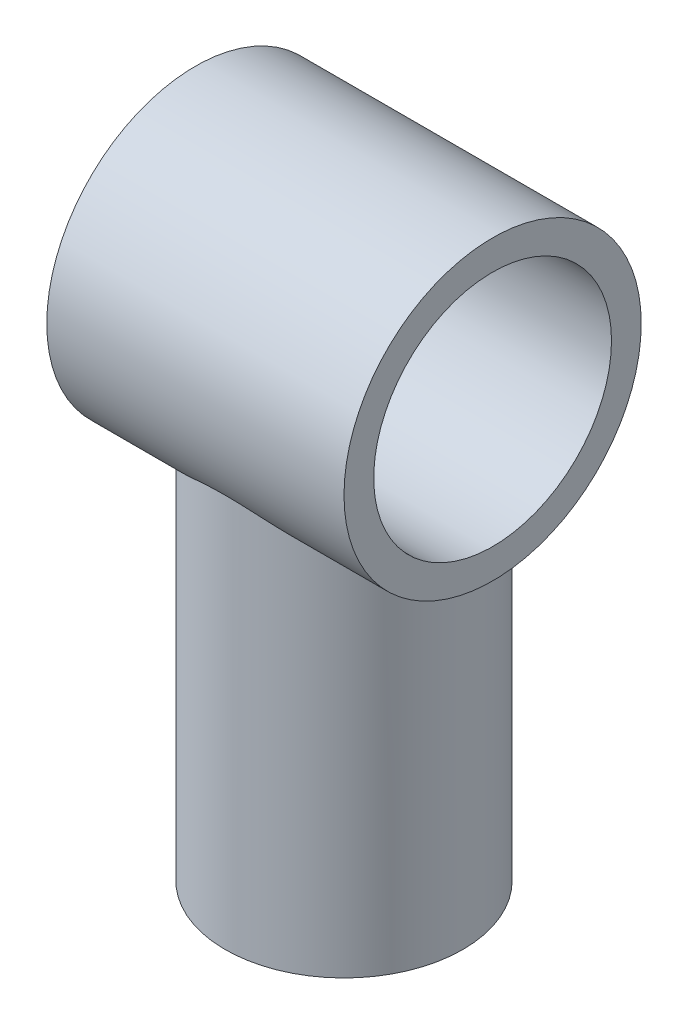
ISO-10303-21;
HEADER;
FILE_DESCRIPTION(('STEP AP214'),'2;1');
FILE_NAME('part.step','',(''),(''),'','','');
FILE_SCHEMA(('AUTOMOTIVE_DESIGN { 1 0 10303 214 1 1 1 1 }'));
ENDSEC;
DATA;
#1=APPLICATION_CONTEXT('core data for automotive mechanical design processes');
#2=APPLICATION_PROTOCOL_DEFINITION('international standard','automotive_design',2000,#1);
#3=PRODUCT_CONTEXT('',#1,'mechanical');
#4=PRODUCT('Part','Part','',(#3));
#5=PRODUCT_RELATED_PRODUCT_CATEGORY('part','',(#4));
#6=PRODUCT_DEFINITION_FORMATION('','',#4);
#7=PRODUCT_DEFINITION_CONTEXT('part definition',#1,'design');
#8=PRODUCT_DEFINITION('design','',#6,#7);
#9=PRODUCT_DEFINITION_SHAPE('','',#8);
#10=(LENGTH_UNIT() NAMED_UNIT(*) SI_UNIT(.MILLI.,.METRE.));
#11=(NAMED_UNIT(*) PLANE_ANGLE_UNIT() SI_UNIT($,.RADIAN.));
#12=(NAMED_UNIT(*) SI_UNIT($,.STERADIAN.) SOLID_ANGLE_UNIT());
#13=UNCERTAINTY_MEASURE_WITH_UNIT(LENGTH_MEASURE(1.E-05),#10,'distance_accuracy_value','');
#14=(GEOMETRIC_REPRESENTATION_CONTEXT(3) GLOBAL_UNCERTAINTY_ASSIGNED_CONTEXT((#13)) GLOBAL_UNIT_ASSIGNED_CONTEXT((#10,
#11,#12)) REPRESENTATION_CONTEXT('',''));
#15=CARTESIAN_POINT('',(0.,0.,0.));
#16=DIRECTION('',(0.,0.,1.));
#17=DIRECTION('',(1.,0.,0.));
#18=AXIS2_PLACEMENT_3D('',#15,#16,#17);
#19=CARTESIAN_POINT('',(50.,0.,0.));
#20=DIRECTION('',(-1.,0.,0.));
#21=DIRECTION('',(0.,0.,1.));
#22=AXIS2_PLACEMENT_3D('',#19,#20,#21);
#23=CYLINDRICAL_SURFACE('',#22,50.);
#24=CARTESIAN_POINT('',(39.9999999999997,-50.,0.));
#25=CARTESIAN_POINT('',(39.9999899655502,-49.9999902865793,0.960337317603068));
#26=CARTESIAN_POINT('',(39.9653441303406,-49.9722619065888,1.92103825174153));
#27=CARTESIAN_POINT('',(39.8273406683369,-49.8619634243921,3.83460710770071));
#28=CARTESIAN_POINT('',(39.7239466787064,-49.7793642995239,4.78747061392244));
#29=CARTESIAN_POINT('',(39.4500093404145,-49.5610369060738,6.67920680850694));
#30=CARTESIAN_POINT('',(39.2793376397599,-49.425207087218,7.61804917305092));
#31=CARTESIAN_POINT('',(38.8737383716898,-49.103485637529,9.47278784316621));
#32=CARTESIAN_POINT('',(38.6388179728261,-48.9175995917573,10.3886866962233));
#33=CARTESIAN_POINT('',(38.1100030483725,-48.5009896347149,12.1860448986505));
#34=CARTESIAN_POINT('',(37.8164961975768,-48.2705607705022,13.0676873720396));
#35=CARTESIAN_POINT('',(37.1734863365713,-47.7684806682389,14.7981074225096));
#36=CARTESIAN_POINT('',(36.8239829762033,-47.4968291724149,15.6468847940366));
#37=CARTESIAN_POINT('',(36.0730992030747,-46.9170712371719,17.3078631155302));
#38=CARTESIAN_POINT('',(35.6717317573899,-46.6089739115738,18.1200731398627));
#39=CARTESIAN_POINT('',(34.8208209286228,-45.9609995364829,19.7058441108159));
#40=CARTESIAN_POINT('',(34.3712676903182,-45.6211159877168,20.4793971034719));
#41=CARTESIAN_POINT('',(33.5813865490853,-45.029602734129,21.7405090451485));
#42=CARTESIAN_POINT('',(33.2531653527827,-44.7852783783389,22.2391661899704));
#43=CARTESIAN_POINT('',(32.5775571715153,-44.2859517021198,23.2175821753519));
#44=CARTESIAN_POINT('',(32.2301742772415,-44.0309516635446,23.6973450123229));
#45=CARTESIAN_POINT('',(31.1602744893443,-43.2518566181224,25.1083888673532));
#46=CARTESIAN_POINT('',(30.4101180866669,-42.7137507901915,26.0112478729575));
#47=CARTESIAN_POINT('',(28.8404448127055,-41.6107960537086,27.7416200402567));
#48=CARTESIAN_POINT('',(28.0207491560544,-41.0458799641914,28.5689268910586));
#49=CARTESIAN_POINT('',(26.3178577666686,-39.9027716762532,30.1449198378464));
#50=CARTESIAN_POINT('',(25.4346692627176,-39.324580994256,30.8936148601352));
#51=CARTESIAN_POINT('',(23.5925581067073,-38.1587647692529,32.322928156125));
#52=CARTESIAN_POINT('',(22.6326666595114,-37.5711331588899,33.0022979067522));
#53=CARTESIAN_POINT('',(21.1458355455337,-36.7013004136444,33.9588113294495));
#54=CARTESIAN_POINT('',(20.64224039534,-36.4132103029056,34.2673057721559));
#55=CARTESIAN_POINT('',(19.6192733098942,-35.843204539501,34.8630820045459));
#56=CARTESIAN_POINT('',(19.0999029436203,-35.5612882775625,35.1503658941106));
#57=CARTESIAN_POINT('',(18.0466515838972,-35.0068809747348,35.7025344651925));
#58=CARTESIAN_POINT('',(17.5128134287128,-34.7343665987454,35.9674773777478));
#59=CARTESIAN_POINT('',(16.4290760361568,-34.2007613147399,36.4752457872218));
#60=CARTESIAN_POINT('',(15.8791759991225,-33.9396709771072,36.7180701804528));
#61=CARTESIAN_POINT('',(14.7636195685685,-33.4322884721389,37.1806380629351));
#62=CARTESIAN_POINT('',(14.1979755903773,-33.1859851023898,37.4003991215583));
#63=CARTESIAN_POINT('',(13.0505560059608,-32.7115298291724,37.8160719858137));
#64=CARTESIAN_POINT('',(12.4687814889326,-32.4833767041346,38.0119853969403));
#65=CARTESIAN_POINT('',(11.2008152379518,-32.0165695692072,38.4063287968087));
#66=CARTESIAN_POINT('',(10.5120434704498,-31.7814677720162,38.6007341429587));
#67=CARTESIAN_POINT('',(9.11450642112936,-31.3469842966395,38.9543981140488));
#68=CARTESIAN_POINT('',(8.40574433067222,-31.1475969537523,39.1136623136884));
#69=CARTESIAN_POINT('',(6.97174066571709,-30.7916235882113,39.3945089701146));
#70=CARTESIAN_POINT('',(6.24653727800009,-30.6349475833404,39.5161707194822));
#71=CARTESIAN_POINT('',(4.78173507298056,-30.3701570484457,39.7200407558248));
#72=CARTESIAN_POINT('',(4.04213643118777,-30.2620419267447,39.802249523505));
#73=CARTESIAN_POINT('',(2.54689613390467,-30.09866807773,39.9259430521321));
#74=CARTESIAN_POINT('',(1.79117012816347,-30.0438912510192,39.9670566128739));
#75=CARTESIAN_POINT('',(0.276633037623535,-29.991729924435,40.0062151100752));
#76=CARTESIAN_POINT('',(-0.482177893098768,-29.9943425926148,40.0042621716977));
#77=CARTESIAN_POINT('',(-1.99661799876641,-30.0568391497324,39.9573259270323));
#78=CARTESIAN_POINT('',(-2.75224446591365,-30.1167645880198,39.9123114028992));
#79=CARTESIAN_POINT('',(-4.2534931367538,-30.2908537992577,39.7803459798636));
#80=CARTESIAN_POINT('',(-4.99911392684159,-30.4050251548359,39.6933892181461));
#81=CARTESIAN_POINT('',(-6.59074393125172,-30.7039918232986,39.4627146667173));
#82=CARTESIAN_POINT('',(-7.4342169983334,-30.8970395344005,39.3122468772218));
#83=CARTESIAN_POINT('',(-9.09582896297436,-31.3383396252938,38.9613603015859));
#84=CARTESIAN_POINT('',(-9.9139623495815,-31.5866039190394,38.7609307341793));
#85=CARTESIAN_POINT('',(-11.5241061197852,-32.1283140744732,38.3131195376455));
#86=CARTESIAN_POINT('',(-12.3160469643137,-32.4218700548251,38.0656231233099));
#87=CARTESIAN_POINT('',(-13.8708234257718,-33.0437864439643,37.5270208256944));
#88=CARTESIAN_POINT('',(-14.6336567098982,-33.3721496344146,37.2359114562595));
#89=CARTESIAN_POINT('',(-15.9397230983043,-33.9680518103301,36.6918302323134));
#90=CARTESIAN_POINT('',(-16.4894565575488,-34.2298156351349,36.4479938970039));
#91=CARTESIAN_POINT('',(-17.5729419964091,-34.7647275928922,35.9381443116078));
#92=CARTESIAN_POINT('',(-18.1066923696073,-35.0378768636103,35.6721288424559));
#93=CARTESIAN_POINT('',(-19.1585214005951,-35.5928257896341,35.1184343896658));
#94=CARTESIAN_POINT('',(-19.676593951385,-35.8746287318452,34.8307471126449));
#95=CARTESIAN_POINT('',(-20.6969491526199,-36.4442690941138,34.2342731018837));
#96=CARTESIAN_POINT('',(-21.1992322528919,-36.7321063418694,33.9254869700271));
#97=CARTESIAN_POINT('',(-22.6837299484836,-37.601947913878,32.9672187050625));
#98=CARTESIAN_POINT('',(-23.6425733340185,-38.1897349005893,32.2863649639094));
#99=CARTESIAN_POINT('',(-25.4967141258075,-39.3645658950611,30.8431085653317));
#100=CARTESIAN_POINT('',(-26.3920219414515,-39.9516100089797,30.0807193178789));
#101=CARTESIAN_POINT('',(-28.140080222068,-41.1270547711198,28.4534658106209));
#102=CARTESIAN_POINT('',(-28.9910480559516,-41.7150704523627,27.5864034467276));
#103=CARTESIAN_POINT('',(-30.6191732938915,-42.8625772422218,25.7673359763548));
#104=CARTESIAN_POINT('',(-31.3963198114992,-43.4220641380729,24.8153183815293));
#105=CARTESIAN_POINT('',(-32.5001847567506,-44.2289438705383,23.326352245045));
#106=CARTESIAN_POINT('',(-32.8575065725974,-44.4922666860121,22.8204057830618));
#107=CARTESIAN_POINT('',(-33.550897972702,-45.0067623269448,21.7881562398974));
#108=CARTESIAN_POINT('',(-33.8869689013916,-45.2579359207843,21.2618544498926));
#109=CARTESIAN_POINT('',(-34.5365326010559,-45.7463252860859,20.1896164803323));
#110=CARTESIAN_POINT('',(-34.8500365246388,-45.9835479413415,19.6436902020073));
#111=CARTESIAN_POINT('',(-35.4534605272059,-46.4425398138118,18.5324581411744));
#112=CARTESIAN_POINT('',(-35.7433749239431,-46.6643053058702,17.9671477357556));
#113=CARTESIAN_POINT('',(-36.4159796166106,-47.181135272975,16.5741428935079));
#114=CARTESIAN_POINT('',(-36.785837189508,-47.4673728778303,15.7368978450569));
#115=CARTESIAN_POINT('',(-37.4707619183107,-48.0001216481262,14.0281401888324));
#116=CARTESIAN_POINT('',(-37.7858426748895,-48.2466426737788,13.1566361533905));
#117=CARTESIAN_POINT('',(-38.2143395421986,-48.5832068786526,11.8271364104957));
#118=CARTESIAN_POINT('',(-38.3498069925526,-48.6898501550263,11.3803061331229));
#119=CARTESIAN_POINT('',(-38.6055950227053,-48.8915717414014,10.4798425549218));
#120=CARTESIAN_POINT('',(-38.7259181671074,-48.9866520094413,10.0262104205504));
#121=CARTESIAN_POINT('',(-39.0635293235028,-49.2538349005461,8.65593274931249));
#122=CARTESIAN_POINT('',(-39.2574913728043,-49.4079050554882,7.72980603591283));
#123=CARTESIAN_POINT('',(-39.5807738677696,-49.66515922552,5.85430089988308));
#124=CARTESIAN_POINT('',(-39.7097474435068,-49.768070144584,4.90482549587199));
#125=CARTESIAN_POINT('',(-39.8992821622341,-49.9194295470422,2.99469380809501));
#126=CARTESIAN_POINT('',(-39.9598434194952,-49.9678781214063,2.03403754300751));
#127=CARTESIAN_POINT('',(-40.0114260092205,-50.0091389078314,0.109806201052019));
#128=CARTESIAN_POINT('',(-40.0024571815622,-50.0019589924202,-0.853768443514967));
#129=CARTESIAN_POINT('',(-39.9151684805636,-49.9321537592954,-2.77570927921253));
#130=CARTESIAN_POINT('',(-39.836852153866,-49.8695312770839,-3.73407573418388));
#131=CARTESIAN_POINT('',(-39.6214404340063,-49.6976330929339,-5.56031714729832));
#132=CARTESIAN_POINT('',(-39.4896329529419,-49.5925574792705,-6.42922228763297));
#133=CARTESIAN_POINT('',(-39.1706393757359,-49.3389260981139,-8.15026869061234));
#134=CARTESIAN_POINT('',(-38.9834568635671,-49.1903731445598,-9.00241103437027));
#135=CARTESIAN_POINT('',(-38.5562009958305,-48.8524671905451,-10.6851855473521));
#136=CARTESIAN_POINT('',(-38.3161172862962,-48.6631062031845,-11.515813470099));
#137=CARTESIAN_POINT('',(-37.7860115062735,-48.246821083766,-13.1512899928913));
#138=CARTESIAN_POINT('',(-37.4959866718846,-48.0198948727563,-13.9561371632226));
#139=CARTESIAN_POINT('',(-36.8497760072207,-47.5169685777808,-15.58553393233));
#140=CARTESIAN_POINT('',(-36.4906105635656,-47.238803428038,-16.4082310798129));
#141=CARTESIAN_POINT('',(-35.7233034147605,-46.6486258267254,-18.0177856508563));
#142=CARTESIAN_POINT('',(-35.3151602588886,-46.3366123725938,-18.8046420118585));
#143=CARTESIAN_POINT('',(-34.4535954645147,-45.6833815156549,-20.3402264231708));
#144=CARTESIAN_POINT('',(-34.0001813522893,-45.3421689685276,-21.0889607800987));
#145=CARTESIAN_POINT('',(-33.0512114826345,-44.6349908059618,-22.547156358329));
#146=CARTESIAN_POINT('',(-32.5556494260749,-44.2690214922323,-23.2566116830179));
#147=CARTESIAN_POINT('',(-31.7342195200158,-43.6694047439141,-24.3557219690513));
#148=CARTESIAN_POINT('',(-31.4209733975839,-43.442239909708,-24.7584580160789));
#149=CARTESIAN_POINT('',(-30.7812274888103,-42.9817949133304,-25.5494559230755));
#150=CARTESIAN_POINT('',(-30.454730791054,-42.7485161806913,-25.9377211160472));
#151=CARTESIAN_POINT('',(-29.4558421711986,-42.0407585963062,-27.0809500209276));
#152=CARTESIAN_POINT('',(-28.7640890541846,-41.5583857530388,-27.8142972392493));
#153=CARTESIAN_POINT('',(-27.330335054102,-40.5792086455479,-29.2244228834484));
#154=CARTESIAN_POINT('',(-26.5882018190994,-40.0823684945803,-29.9010409793004));
#155=CARTESIAN_POINT('',(-25.05715696613,-39.0835527344274,-31.1952511829746));
#156=CARTESIAN_POINT('',(-24.2682422698136,-38.5815767890951,-31.812839399468));
#157=CARTESIAN_POINT('',(-22.9639799465492,-37.7782236226682,-32.7570649064664));
#158=CARTESIAN_POINT('',(-22.463006507567,-37.4755625933784,-33.1026381609827));
#159=CARTESIAN_POINT('',(-21.4443141791753,-36.8739687428868,-33.7714763386967));
#160=CARTESIAN_POINT('',(-20.9265981116711,-36.5750353050613,-34.0947449927636));
#161=CARTESIAN_POINT('',(-19.8739710030738,-35.9831237124956,-34.7188696490502));
#162=CARTESIAN_POINT('',(-19.3390493839983,-35.690149409338,-35.0197114710879));
#163=CARTESIAN_POINT('',(-18.2521387352774,-35.1130809139986,-35.5982931437609));
#164=CARTESIAN_POINT('',(-17.7001491712871,-34.8289870003957,-35.876032270115));
#165=CARTESIAN_POINT('',(-16.580886657556,-34.2737583473937,-36.4068189966516));
#166=CARTESIAN_POINT('',(-16.0136740248489,-34.0025816947677,-36.659949690076));
#167=CARTESIAN_POINT('',(-14.8619199206455,-33.4755799688259,-37.1417962141712));
#168=CARTESIAN_POINT('',(-14.2773775075142,-33.2197557319952,-37.37051071504));
#169=CARTESIAN_POINT('',(-13.0916009734811,-32.7276550029956,-37.8022171685463));
#170=CARTESIAN_POINT('',(-12.4903858610514,-32.4913573809123,-38.0052370554788));
#171=CARTESIAN_POINT('',(-11.270964952699,-32.0423686271172,-38.3845411057123));
#172=CARTESIAN_POINT('',(-10.6527610021374,-31.829674944045,-38.5608281593336));
#173=CARTESIAN_POINT('',(-9.35218977975302,-31.4174279680902,-38.897575926953));
#174=CARTESIAN_POINT('',(-8.66852466279392,-31.2201137462773,-39.0558044682243));
#175=CARTESIAN_POINT('',(-7.28413538690907,-30.8644041515932,-39.3375156387851));
#176=CARTESIAN_POINT('',(-6.58341421638295,-30.7060020141018,-39.4610043079249));
#177=CARTESIAN_POINT('',(-5.16935839309245,-30.4342274616714,-39.6709888377274));
#178=CARTESIAN_POINT('',(-4.45605511360474,-30.3207560928744,-39.757566023523));
#179=CARTESIAN_POINT('',(-3.01965791766823,-30.1431693965293,-39.8923788269256));
#180=CARTESIAN_POINT('',(-2.29656406664903,-30.0790537393064,-39.9406147006359));
#181=CARTESIAN_POINT('',(-0.842077194984,-30.0029823041374,-39.9977924999235));
#182=CARTESIAN_POINT('',(-0.110660418364865,-29.9913131118693,-40.0065185319396));
#183=CARTESIAN_POINT('',(1.35041092533574,-30.0214936990287,-39.9838747579982));
#184=CARTESIAN_POINT('',(2.0800655227959,-30.0633425491493,-39.9525056482675));
#185=CARTESIAN_POINT('',(3.53274167534813,-30.1986156267926,-39.850353927955));
#186=CARTESIAN_POINT('',(4.2557527545654,-30.2921105479852,-39.7795172926711));
#187=CARTESIAN_POINT('',(5.68923693540063,-30.5264953215509,-39.5999333237637));
#188=CARTESIAN_POINT('',(6.39970808184337,-30.6673924971755,-39.4911801322553));
#189=CARTESIAN_POINT('',(7.9970882234701,-31.0353845079061,-39.2029776592161));
#190=CARTESIAN_POINT('',(8.87897247143832,-31.2755207424113,-39.0123208743918));
#191=CARTESIAN_POINT('',(10.6120481513387,-31.8109269637358,-38.5769832571289));
#192=CARTESIAN_POINT('',(11.4632293668372,-32.1062151040709,-38.3322846317051));
#193=CARTESIAN_POINT('',(13.1349650275381,-32.7403049515591,-37.7921453327399));
#194=CARTESIAN_POINT('',(13.9554406356898,-33.0792099116732,-37.4965836739564));
#195=CARTESIAN_POINT('',(15.5633966668759,-33.7890318460016,-36.8582295147521));
#196=CARTESIAN_POINT('',(16.3508757877217,-34.1599500818385,-36.5154351526028));
#197=CARTESIAN_POINT('',(17.6826467099842,-34.8200978049306,-35.8846591043814));
#198=CARTESIAN_POINT('',(18.2346562511273,-35.1039955639853,-35.6072491818316));
#199=CARTESIAN_POINT('',(19.3216968557097,-35.680746144092,-35.0292876905311));
#200=CARTESIAN_POINT('',(19.8567264361814,-35.9735997429524,-34.7287341083094));
#201=CARTESIAN_POINT('',(20.9100838876255,-36.5655815589419,-34.104885410554));
#202=CARTESIAN_POINT('',(21.4284059039464,-36.8647119162294,-33.7815824468452));
#203=CARTESIAN_POINT('',(22.4481724792792,-37.4666686078201,-33.1127063182206));
#204=CARTESIAN_POINT('',(22.9496174625558,-37.7694948489528,-32.7671337137693));
#205=CARTESIAN_POINT('',(24.4295880724515,-38.680725502598,-31.6966775337519));
#206=CARTESIAN_POINT('',(25.3829607031959,-39.291431729652,-30.9385234165528));
#207=CARTESIAN_POINT('',(27.2200771578108,-40.5025504494575,-29.3351889955649));
#208=CARTESIAN_POINT('',(28.103831948942,-41.1029645518739,-28.4900224478867));
#209=CARTESIAN_POINT('',(29.8090613790156,-42.2871017262633,-26.7014356696774));
#210=CARTESIAN_POINT('',(30.6295577229045,-42.8704990196431,-25.7568637916352));
#211=CARTESIAN_POINT('',(32.188673690957,-43.9979659036999,-23.7796863680122));
#212=CARTESIAN_POINT('',(32.9272797244361,-44.5420289611889,-22.7470662599228));
#213=CARTESIAN_POINT('',(33.9657874678803,-45.3169070708633,-21.1360479259287));
#214=CARTESIAN_POINT('',(34.3000869077127,-45.5680972453489,-20.5892776142864));
#215=CARTESIAN_POINT('',(34.9446670765632,-46.0552401440178,-19.4752209561247));
#216=CARTESIAN_POINT('',(35.2549515997656,-46.2911952742482,-18.9079378713407));
#217=CARTESIAN_POINT('',(35.8500196571095,-46.7459851292346,-17.7538005313286));
#218=CARTESIAN_POINT('',(36.134813876546,-46.9648270227927,-17.1669546195832));
#219=CARTESIAN_POINT('',(36.6775591965352,-47.383684743587,-15.9745348982222));
#220=CARTESIAN_POINT('',(36.9355136375248,-47.5837029132976,-15.3689634313585));
#221=CARTESIAN_POINT('',(37.5075780365237,-48.0289063336988,-13.9274237415027));
#222=CARTESIAN_POINT('',(37.8102180458274,-48.2657599321629,-13.0842633407671));
#223=CARTESIAN_POINT('',(38.3605959095246,-48.6981142613755,-11.3699203786811));
#224=CARTESIAN_POINT('',(38.6083378601554,-48.8936180774025,-10.4987399136156));
#225=CARTESIAN_POINT('',(39.0451272892421,-49.2392543438645,-8.73506769004326));
#226=CARTESIAN_POINT('',(39.2343062315343,-49.389488396611,-7.84262857965294));
#227=CARTESIAN_POINT('',(39.5518275913767,-49.6420968819956,-6.04063896159304));
#228=CARTESIAN_POINT('',(39.6801970899424,-49.7444926187777,-5.1310962588637));
#229=CARTESIAN_POINT('',(39.8512087980051,-49.8810276621094,-3.51776144329625));
#230=CARTESIAN_POINT('',(39.9069489166209,-49.9255850856031,-2.81621264179274));
#231=CARTESIAN_POINT('',(39.9627464265363,-49.9702010256453,-1.76151114851004));
#232=CARTESIAN_POINT('',(39.9767101579156,-49.9813696461639,-1.40950530367484));
#233=CARTESIAN_POINT('',(39.9953399567363,-49.9962718520562,-0.705016037755383));
#234=CARTESIAN_POINT('',(40.0000036835697,-50.0000035657228,-0.352532518781879));
#235=CARTESIAN_POINT('',(39.9999999999997,-50.,0.));
#236=B_SPLINE_CURVE_WITH_KNOTS('',3,(#24,#25,#26,#27,#28,#29,#30,#31,#32,#33,#34,#35,#36,#37,
#38,#39,#40,#41,#42,#43,#44,#45,#46,#47,#48,#49,#50,#51,#52,#53,#54,#55,#56,#57,#58,#59,#60,#61,
#62,#63,#64,#65,#66,#67,#68,#69,#70,#71,#72,#73,#74,#75,#76,#77,#78,#79,#80,#81,#82,#83,#84,#85,
#86,#87,#88,#89,#90,#91,#92,#93,#94,#95,#96,#97,#98,#99,#100,#101,#102,#103,#104,#105,#106,#107,
#108,#109,#110,#111,#112,#113,#114,#115,#116,#117,#118,#119,#120,#121,#122,#123,#124,#125,#126,
#127,#128,#129,#130,#131,#132,#133,#134,#135,#136,#137,#138,#139,#140,#141,#142,#143,#144,#145,
#146,#147,#148,#149,#150,#151,#152,#153,#154,#155,#156,#157,#158,#159,#160,#161,#162,#163,#164,
#165,#166,#167,#168,#169,#170,#171,#172,#173,#174,#175,#176,#177,#178,#179,#180,#181,#182,#183,
#184,#185,#186,#187,#188,#189,#190,#191,#192,#193,#194,#195,#196,#197,#198,#199,#200,#201,#202,
#203,#204,#205,#206,#207,#208,#209,#210,#211,#212,#213,#214,#215,#216,#217,#218,#219,#220,#221,
#222,#223,#224,#225,#226,#227,#228,#229,#230,#231,#232,#233,#234,#235),.UNSPECIFIED.,.T.,.F.,(4,
2,2,2,2,2,2,2,2,2,2,2,2,2,2,2,2,2,2,2,2,2,2,2,2,2,2,2,2,2,2,2,2,2,2,2,2,2,2,2,2,2,2,2,2,2,2,2,2,
2,2,2,2,2,2,2,2,2,2,2,2,2,2,2,2,2,2,2,2,2,2,2,2,2,2,2,2,2,2,2,2,2,2,2,2,2,2,2,2,2,2,2,2,2,2,2,2,
2,2,2,2,2,2,2,2,4),(0.,2.8806275861568,5.762780030747,8.65045784797842,11.537813603763,
14.4066614925712,17.2755273215981,20.1436772586725,23.0124149288824,24.9469208273242,
26.8810153286382,30.749879343647,34.6290105291467,38.507700765339,42.4470818946003,
44.4179128084293,46.3885483442504,48.3538775799512,50.3193048295858,52.2832238029098,
54.2470104861715,56.5051583579519,58.7629477451064,61.0159431092657,63.2689110216509,
65.5420502165158,67.8150772411175,70.08975336485,72.3647475419903,74.9955216323602,
77.6268639103998,80.2647076887451,82.9027624329285,84.8697610369223,86.8369566796517,
88.8049089923122,90.7728051889147,94.7124150123825,98.6513778901096,102.695863563299,
106.740944754875,108.759483006771,110.777893428343,112.795299404486,114.813189903704,
117.687325407658,120.560746262904,121.997183290601,123.433376737503,126.305440568867,
129.19267556847,132.079905745443,134.9667273299,137.853401282022,140.505730689314,
143.157888470558,145.810565801165,148.463389986564,151.280030848168,154.096755159395,
156.913011968713,159.729690417735,161.404844892208,163.079611121496,166.429347142809,
169.788251812517,173.147377753238,175.18598961902,177.224259657292,179.263807723302,
181.303419706099,183.335886303556,185.368463540742,187.398811693755,189.428940171327,
191.613888302885,193.798456325765,195.978186014466,198.157901143391,200.349512624176,
202.541086049539,204.735666783287,206.930586717202,209.727217531656,212.524770498097,
215.329072235659,218.133484539455,220.172557144903,222.211807348122,224.251764542407,
226.291670416716,230.374537434967,234.456759966271,238.592973263586,242.72987199107,
244.794153116108,246.85810743095,248.921192463368,250.98402041954,253.760898388863,
256.537569090671,259.307960673146,262.07711732055,264.190991665153,265.248182085266,
266.305638543539),.UNSPECIFIED.);
#237=CARTESIAN_POINT('',(39.9999999999997,-50.,0.));
#238=VERTEX_POINT('',#237);
#239=EDGE_CURVE('E60',#238,#238,#236,.T.);
#240=ORIENTED_EDGE('',*,*,#239,.F.);
#241=EDGE_LOOP('',(#240));
#242=FACE_BOUND('',#241,.T.);
#243=CARTESIAN_POINT('',(50.,0.,0.));
#244=DIRECTION('',(1.,0.,0.));
#245=DIRECTION('',(0.,0.,-1.));
#246=AXIS2_PLACEMENT_3D('',#243,#244,#245);
#247=CIRCLE('',#246,50.);
#248=CARTESIAN_POINT('',(50.,0.,-50.));
#249=VERTEX_POINT('',#248);
#250=EDGE_CURVE('E10',#249,#249,#247,.T.);
#251=ORIENTED_EDGE('',*,*,#250,.F.);
#252=EDGE_LOOP('',(#251));
#253=FACE_BOUND('',#252,.T.);
#254=CARTESIAN_POINT('',(-50.,0.,0.));
#255=DIRECTION('',(1.,0.,0.));
#256=DIRECTION('',(0.,0.,-1.));
#257=AXIS2_PLACEMENT_3D('',#254,#255,#256);
#258=CIRCLE('',#257,50.);
#259=CARTESIAN_POINT('',(-50.,0.,-50.));
#260=VERTEX_POINT('',#259);
#261=EDGE_CURVE('E44',#260,#260,#258,.T.);
#262=ORIENTED_EDGE('',*,*,#261,.T.);
#263=EDGE_LOOP('',(#262));
#264=FACE_BOUND('',#263,.T.);
#265=ADVANCED_FACE('F37',(#242,#253,#264),#23,.T.);
#266=CARTESIAN_POINT('',(50.,0.,0.));
#267=DIRECTION('',(1.,0.,0.));
#268=DIRECTION('',(0.,0.,-1.));
#269=AXIS2_PLACEMENT_3D('',#266,#267,#268);
#270=PLANE('',#269);
#271=CARTESIAN_POINT('',(50.,0.,0.));
#272=DIRECTION('',(1.,0.,0.));
#273=DIRECTION('',(0.,0.,-1.));
#274=AXIS2_PLACEMENT_3D('',#271,#272,#273);
#275=CIRCLE('',#274,40.);
#276=CARTESIAN_POINT('',(50.,0.,-40.));
#277=VERTEX_POINT('',#276);
#278=EDGE_CURVE('E54',#277,#277,#275,.T.);
#279=ORIENTED_EDGE('',*,*,#278,.F.);
#280=EDGE_LOOP('',(#279));
#281=FACE_BOUND('',#280,.T.);
#282=ORIENTED_EDGE('',*,*,#250,.T.);
#283=EDGE_LOOP('',(#282));
#284=FACE_BOUND('',#283,.T.);
#285=ADVANCED_FACE('F88',(#281,#284),#270,.T.);
#286=CARTESIAN_POINT('',(-50.,0.,0.));
#287=DIRECTION('',(1.,0.,0.));
#288=DIRECTION('',(0.,0.,-1.));
#289=AXIS2_PLACEMENT_3D('',#286,#287,#288);
#290=PLANE('',#289);
#291=CARTESIAN_POINT('',(-50.,0.,0.));
#292=DIRECTION('',(1.,0.,0.));
#293=DIRECTION('',(0.,0.,-1.));
#294=AXIS2_PLACEMENT_3D('',#291,#292,#293);
#295=CIRCLE('',#294,40.);
#296=CARTESIAN_POINT('',(-50.,0.,-40.));
#297=VERTEX_POINT('',#296);
#298=EDGE_CURVE('E49',#297,#297,#295,.T.);
#299=ORIENTED_EDGE('',*,*,#298,.T.);
#300=EDGE_LOOP('',(#299));
#301=FACE_BOUND('',#300,.T.);
#302=ORIENTED_EDGE('',*,*,#261,.F.);
#303=EDGE_LOOP('',(#302));
#304=FACE_BOUND('',#303,.T.);
#305=ADVANCED_FACE('F84',(#301,#304),#290,.F.);
#306=CARTESIAN_POINT('',(-50.,0.,0.));
#307=DIRECTION('',(1.,0.,0.));
#308=DIRECTION('',(0.,0.,-1.));
#309=AXIS2_PLACEMENT_3D('',#306,#307,#308);
#310=CYLINDRICAL_SURFACE('',#309,40.);
#311=ORIENTED_EDGE('',*,*,#298,.F.);
#312=EDGE_LOOP('',(#311));
#313=FACE_BOUND('',#312,.T.);
#314=ORIENTED_EDGE('',*,*,#278,.T.);
#315=EDGE_LOOP('',(#314));
#316=FACE_BOUND('',#315,.T.);
#317=ADVANCED_FACE('F77',(#313,#316),#310,.F.);
#318=CARTESIAN_POINT('',(-1.13403313885625E-12,-162.4,0.));
#319=DIRECTION('',(0.,-1.,0.));
#320=DIRECTION('',(1.,0.,0.));
#321=AXIS2_PLACEMENT_3D('',#318,#319,#320);
#322=PLANE('',#321);
#323=CARTESIAN_POINT('',(-1.13403313885625E-12,-162.4,0.));
#324=DIRECTION('',(0.,-1.,0.));
#325=DIRECTION('',(1.,0.,0.));
#326=AXIS2_PLACEMENT_3D('',#323,#324,#325);
#327=CIRCLE('',#326,40.);
#328=CARTESIAN_POINT('',(39.9999999999989,-162.4,0.));
#329=VERTEX_POINT('',#328);
#330=EDGE_CURVE('E69',#329,#329,#327,.T.);
#331=ORIENTED_EDGE('',*,*,#330,.T.);
#332=EDGE_LOOP('',(#331));
#333=FACE_BOUND('',#332,.T.);
#334=ADVANCED_FACE('F75',(#333),#322,.T.);
#335=CARTESIAN_POINT('',(3.49155116846994E-13,50.0010000000004,0.));
#336=DIRECTION('',(0.,-1.,0.));
#337=DIRECTION('',(1.,0.,0.));
#338=AXIS2_PLACEMENT_3D('',#335,#336,#337);
#339=CYLINDRICAL_SURFACE('',#338,40.);
#340=ORIENTED_EDGE('',*,*,#330,.F.);
#341=EDGE_LOOP('',(#340));
#342=FACE_BOUND('',#341,.T.);
#343=ORIENTED_EDGE('',*,*,#239,.T.);
#344=EDGE_LOOP('',(#343));
#345=FACE_BOUND('',#344,.T.);
#346=ADVANCED_FACE('F70',(#342,#345),#339,.T.);
#347=CLOSED_SHELL('',(#265,#285,#305,#317,#334,#346));
#348=MANIFOLD_SOLID_BREP('B2',#347);
#349=ADVANCED_BREP_SHAPE_REPRESENTATION('',(#18,#348),#14);
#350=SHAPE_DEFINITION_REPRESENTATION(#9,#349);
ENDSEC;
END-ISO-10303-21;
